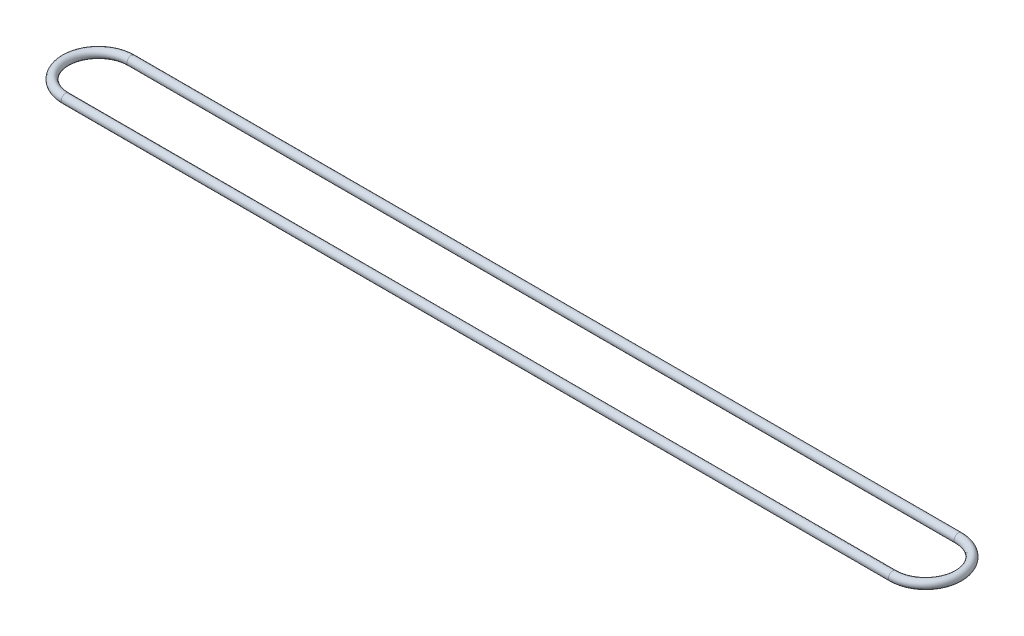
ISO-10303-21;
HEADER;
FILE_DESCRIPTION(('STEP AP214'),'2;1');
FILE_NAME('part.step','',(''),(''),'','','');
FILE_SCHEMA(('AUTOMOTIVE_DESIGN { 1 0 10303 214 1 1 1 1 }'));
ENDSEC;
DATA;
#1=APPLICATION_CONTEXT('core data for automotive mechanical design processes');
#2=APPLICATION_PROTOCOL_DEFINITION('international standard','automotive_design',2000,#1);
#3=PRODUCT_CONTEXT('',#1,'mechanical');
#4=PRODUCT('Part','Part','',(#3));
#5=PRODUCT_RELATED_PRODUCT_CATEGORY('part','',(#4));
#6=PRODUCT_DEFINITION_FORMATION('','',#4);
#7=PRODUCT_DEFINITION_CONTEXT('part definition',#1,'design');
#8=PRODUCT_DEFINITION('design','',#6,#7);
#9=PRODUCT_DEFINITION_SHAPE('','',#8);
#10=(LENGTH_UNIT() NAMED_UNIT(*) SI_UNIT(.MILLI.,.METRE.));
#11=(NAMED_UNIT(*) PLANE_ANGLE_UNIT() SI_UNIT($,.RADIAN.));
#12=(NAMED_UNIT(*) SI_UNIT($,.STERADIAN.) SOLID_ANGLE_UNIT());
#13=UNCERTAINTY_MEASURE_WITH_UNIT(LENGTH_MEASURE(1.E-05),#10,'distance_accuracy_value','');
#14=(GEOMETRIC_REPRESENTATION_CONTEXT(3) GLOBAL_UNCERTAINTY_ASSIGNED_CONTEXT((#13)) GLOBAL_UNIT_ASSIGNED_CONTEXT((#10,
#11,#12)) REPRESENTATION_CONTEXT('',''));
#15=CARTESIAN_POINT('',(0.,0.,0.));
#16=DIRECTION('',(0.,0.,1.));
#17=DIRECTION('',(1.,0.,0.));
#18=AXIS2_PLACEMENT_3D('',#15,#16,#17);
#19=CARTESIAN_POINT('',(411.143015057289,0.,0.));
#20=DIRECTION('',(0.,-1.,0.));
#21=DIRECTION('',(0.,0.,-1.));
#22=AXIS2_PLACEMENT_3D('',#19,#20,#21);
#23=TOROIDAL_SURFACE('',#22,36.4322964647,4.7625);
#24=CARTESIAN_POINT('',(411.143015057289,0.,-36.4322964647));
#25=DIRECTION('',(-1.,0.,0.));
#26=DIRECTION('',(0.,0.,1.));
#27=AXIS2_PLACEMENT_3D('',#24,#25,#26);
#28=CIRCLE('',#27,4.7625);
#29=CARTESIAN_POINT('',(411.143015057289,0.,-41.1947964647));
#30=VERTEX_POINT('',#29);
#31=EDGE_CURVE('E58',#30,#30,#28,.T.);
#32=CARTESIAN_POINT('',(411.143015057289,0.,36.4322964647));
#33=DIRECTION('',(1.,0.,0.));
#34=DIRECTION('',(0.,0.,-1.));
#35=AXIS2_PLACEMENT_3D('',#32,#33,#34);
#36=CIRCLE('',#35,4.7625);
#37=CARTESIAN_POINT('',(411.143015057289,0.,41.1947964647));
#38=VERTEX_POINT('',#37);
#39=EDGE_CURVE('E54',#38,#38,#36,.T.);
#40=CARTESIAN_POINT('',(411.143015057289,0.,0.));
#41=DIRECTION('',(0.,-1.,0.));
#42=DIRECTION('',(0.,0.,-1.));
#43=AXIS2_PLACEMENT_3D('',#40,#41,#42);
#44=CIRCLE('',#43,41.1947964647);
#45=EDGE_CURVE('',#30,#38,#44,.T.);
#46=ORIENTED_EDGE('',*,*,#31,.F.);
#47=ORIENTED_EDGE('',*,*,#39,.T.);
#48=ORIENTED_EDGE('',*,*,#45,.T.);
#49=ORIENTED_EDGE('',*,*,#45,.F.);
#50=EDGE_LOOP('',(#46,#48,#47,#49));
#51=FACE_BOUND('',#50,.T.);
#52=ADVANCED_FACE('F43',(#51),#23,.T.);
#53=CARTESIAN_POINT('',(411.143015057289,0.,36.4322964647));
#54=DIRECTION('',(-1.,0.,0.));
#55=DIRECTION('',(0.,0.,1.));
#56=AXIS2_PLACEMENT_3D('',#53,#54,#55);
#57=CYLINDRICAL_SURFACE('',#56,4.7625);
#58=CARTESIAN_POINT('',(-506.592392013311,0.,36.4322964647));
#59=DIRECTION('',(1.,0.,0.));
#60=DIRECTION('',(0.,0.,-1.));
#61=AXIS2_PLACEMENT_3D('',#58,#59,#60);
#62=CIRCLE('',#61,4.7625);
#63=CARTESIAN_POINT('',(-506.592392013311,0.,41.1947964647));
#64=VERTEX_POINT('',#63);
#65=EDGE_CURVE('E50',#64,#64,#62,.T.);
#66=ORIENTED_EDGE('',*,*,#65,.T.);
#67=EDGE_LOOP('',(#66));
#68=FACE_BOUND('',#67,.T.);
#69=ORIENTED_EDGE('',*,*,#39,.F.);
#70=EDGE_LOOP('',(#69));
#71=FACE_BOUND('',#70,.T.);
#72=ADVANCED_FACE('F67',(#68,#71),#57,.T.);
#73=CARTESIAN_POINT('',(-506.592392013311,0.,0.));
#74=DIRECTION('',(0.,-1.,0.));
#75=DIRECTION('',(0.,0.,-1.));
#76=AXIS2_PLACEMENT_3D('',#73,#74,#75);
#77=TOROIDAL_SURFACE('',#76,36.4322964647,4.7625);
#78=CARTESIAN_POINT('',(-506.592392013311,0.,-36.4322964647));
#79=DIRECTION('',(-1.,0.,0.));
#80=DIRECTION('',(0.,0.,1.));
#81=AXIS2_PLACEMENT_3D('',#78,#79,#80);
#82=CIRCLE('',#81,4.7625);
#83=CARTESIAN_POINT('',(-506.592392013311,0.,-41.1947964647));
#84=VERTEX_POINT('',#83);
#85=EDGE_CURVE('E11',#84,#84,#82,.T.);
#86=CARTESIAN_POINT('',(-506.592392013311,0.,0.));
#87=DIRECTION('',(0.,-1.,0.));
#88=DIRECTION('',(0.,0.,-1.));
#89=AXIS2_PLACEMENT_3D('',#86,#87,#88);
#90=CIRCLE('',#89,41.1947964647);
#91=EDGE_CURVE('',#64,#84,#90,.T.);
#92=ORIENTED_EDGE('',*,*,#65,.F.);
#93=ORIENTED_EDGE('',*,*,#85,.T.);
#94=ORIENTED_EDGE('',*,*,#91,.T.);
#95=ORIENTED_EDGE('',*,*,#91,.F.);
#96=EDGE_LOOP('',(#92,#94,#93,#95));
#97=FACE_BOUND('',#96,.T.);
#98=ADVANCED_FACE('F73',(#97),#77,.T.);
#99=CARTESIAN_POINT('',(-506.592392013311,0.,-36.4322964647));
#100=DIRECTION('',(1.,0.,0.));
#101=DIRECTION('',(0.,0.,-1.));
#102=AXIS2_PLACEMENT_3D('',#99,#100,#101);
#103=CYLINDRICAL_SURFACE('',#102,4.7625);
#104=ORIENTED_EDGE('',*,*,#31,.T.);
#105=EDGE_LOOP('',(#104));
#106=FACE_BOUND('',#105,.T.);
#107=ORIENTED_EDGE('',*,*,#85,.F.);
#108=EDGE_LOOP('',(#107));
#109=FACE_BOUND('',#108,.T.);
#110=ADVANCED_FACE('F45',(#106,#109),#103,.T.);
#111=CLOSED_SHELL('',(#52,#72,#98,#110));
#112=MANIFOLD_SOLID_BREP('B2',#111);
#113=ADVANCED_BREP_SHAPE_REPRESENTATION('',(#18,#112),#14);
#114=SHAPE_DEFINITION_REPRESENTATION(#9,#113);
ENDSEC;
END-ISO-10303-21;
